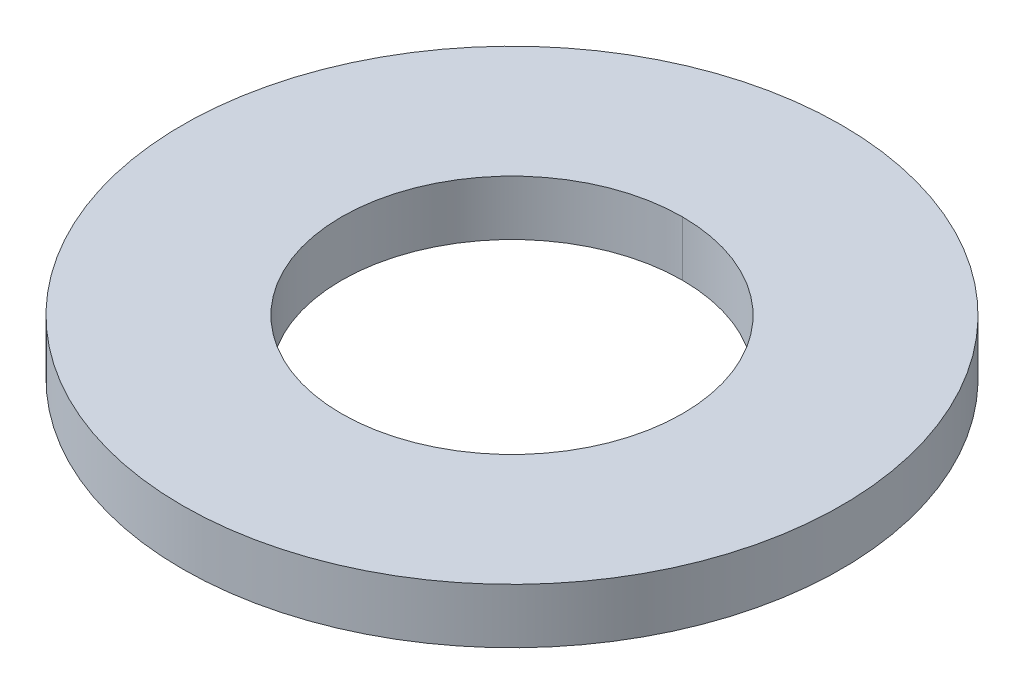
ISO-10303-21;
HEADER;
FILE_DESCRIPTION(('STEP AP214'),'2;1');
FILE_NAME('part.step','',(''),(''),'','','');
FILE_SCHEMA(('AUTOMOTIVE_DESIGN { 1 0 10303 214 1 1 1 1 }'));
ENDSEC;
DATA;
#1=APPLICATION_CONTEXT('core data for automotive mechanical design processes');
#2=APPLICATION_PROTOCOL_DEFINITION('international standard','automotive_design',2000,#1);
#3=PRODUCT_CONTEXT('',#1,'mechanical');
#4=PRODUCT('Part','Part','',(#3));
#5=PRODUCT_RELATED_PRODUCT_CATEGORY('part','',(#4));
#6=PRODUCT_DEFINITION_FORMATION('','',#4);
#7=PRODUCT_DEFINITION_CONTEXT('part definition',#1,'design');
#8=PRODUCT_DEFINITION('design','',#6,#7);
#9=PRODUCT_DEFINITION_SHAPE('','',#8);
#10=(LENGTH_UNIT() NAMED_UNIT(*) SI_UNIT(.MILLI.,.METRE.));
#11=(NAMED_UNIT(*) PLANE_ANGLE_UNIT() SI_UNIT($,.RADIAN.));
#12=(NAMED_UNIT(*) SI_UNIT($,.STERADIAN.) SOLID_ANGLE_UNIT());
#13=UNCERTAINTY_MEASURE_WITH_UNIT(LENGTH_MEASURE(1.E-05),#10,'distance_accuracy_value','');
#14=(GEOMETRIC_REPRESENTATION_CONTEXT(3) GLOBAL_UNCERTAINTY_ASSIGNED_CONTEXT((#13)) GLOBAL_UNIT_ASSIGNED_CONTEXT((#10,
#11,#12)) REPRESENTATION_CONTEXT('',''));
#15=CARTESIAN_POINT('',(0.,0.,0.));
#16=DIRECTION('',(0.,0.,1.));
#17=DIRECTION('',(1.,0.,0.));
#18=AXIS2_PLACEMENT_3D('',#15,#16,#17);
#19=CARTESIAN_POINT('',(0.,-1.5875,0.));
#20=DIRECTION('',(0.,1.,0.));
#21=DIRECTION('',(0.,0.,1.));
#22=AXIS2_PLACEMENT_3D('',#19,#20,#21);
#23=CYLINDRICAL_SURFACE('',#22,4.7625);
#24=CARTESIAN_POINT('',(0.,-0.79375,0.));
#25=DIRECTION('',(0.,-1.,0.));
#26=DIRECTION('',(0.,0.,-1.));
#27=AXIS2_PLACEMENT_3D('',#24,#25,#26);
#28=CIRCLE('',#27,4.7625);
#29=CARTESIAN_POINT('',(0.,-0.79375,-4.7625));
#30=VERTEX_POINT('',#29);
#31=EDGE_CURVE('E11',#30,#30,#28,.F.);
#32=ORIENTED_EDGE('',*,*,#31,.F.);
#33=EDGE_LOOP('',(#32));
#34=FACE_BOUND('',#33,.T.);
#35=CARTESIAN_POINT('',(0.,-1.5875,0.));
#36=DIRECTION('',(0.,1.,0.));
#37=DIRECTION('',(0.,0.,1.));
#38=AXIS2_PLACEMENT_3D('',#35,#36,#37);
#39=CIRCLE('',#38,4.7625);
#40=CARTESIAN_POINT('',(0.,-1.5875,4.7625));
#41=VERTEX_POINT('',#40);
#42=EDGE_CURVE('E93',#41,#41,#39,.T.);
#43=ORIENTED_EDGE('',*,*,#42,.T.);
#44=EDGE_LOOP('',(#43));
#45=FACE_BOUND('',#44,.T.);
#46=ADVANCED_FACE('F52',(#34,#45),#23,.T.);
#47=CARTESIAN_POINT('',(0.,-1.5875,0.));
#48=DIRECTION('',(0.,1.,0.));
#49=DIRECTION('',(1.,0.,0.));
#50=AXIS2_PLACEMENT_3D('',#47,#48,#49);
#51=PLANE('',#50);
#52=CARTESIAN_POINT('',(0.,-1.5875,0.));
#53=DIRECTION('',(0.,1.,0.));
#54=DIRECTION('',(0.,0.,1.));
#55=AXIS2_PLACEMENT_3D('',#52,#53,#54);
#56=CIRCLE('',#55,2.4638);
#57=CARTESIAN_POINT('',(0.,-1.5875,-2.4638));
#58=VERTEX_POINT('',#57);
#59=CARTESIAN_POINT('',(0.,-1.5875,2.4638));
#60=VERTEX_POINT('',#59);
#61=EDGE_CURVE('E62',#58,#60,#56,.T.);
#62=ORIENTED_EDGE('',*,*,#61,.T.);
#63=CARTESIAN_POINT('',(0.,-1.5875,0.));
#64=DIRECTION('',(0.,1.,0.));
#65=DIRECTION('',(0.,0.,1.));
#66=AXIS2_PLACEMENT_3D('',#63,#64,#65);
#67=CIRCLE('',#66,2.4638);
#68=EDGE_CURVE('E92',#60,#58,#67,.T.);
#69=ORIENTED_EDGE('',*,*,#68,.T.);
#70=EDGE_LOOP('',(#62,#69));
#71=FACE_BOUND('',#70,.T.);
#72=ORIENTED_EDGE('',*,*,#42,.F.);
#73=EDGE_LOOP('',(#72));
#74=FACE_BOUND('',#73,.T.);
#75=ADVANCED_FACE('F54',(#71,#74),#51,.F.);
#76=CARTESIAN_POINT('',(0.,1.5875,0.));
#77=DIRECTION('',(0.,-1.,0.));
#78=DIRECTION('',(0.,0.,-1.));
#79=AXIS2_PLACEMENT_3D('',#76,#77,#78);
#80=CYLINDRICAL_SURFACE('',#79,2.4638);
#81=DIRECTION('',(0.,-1.,0.));
#82=VECTOR('',#81,1.);
#83=CARTESIAN_POINT('',(0.,1.5875,2.4638));
#84=LINE('',#83,#82);
#85=CARTESIAN_POINT('',(0.,-0.79375,2.4638));
#86=VERTEX_POINT('',#85);
#87=EDGE_CURVE('E80',#86,#60,#84,.T.);
#88=ORIENTED_EDGE('',*,*,#87,.F.);
#89=CARTESIAN_POINT('',(0.,-0.79375,0.));
#90=DIRECTION('',(0.,-1.,0.));
#91=DIRECTION('',(0.,0.,-1.));
#92=AXIS2_PLACEMENT_3D('',#89,#90,#91);
#93=CIRCLE('',#92,2.4638);
#94=CARTESIAN_POINT('',(0.,-0.79375,-2.4638));
#95=VERTEX_POINT('',#94);
#96=EDGE_CURVE('E70',#86,#95,#93,.F.);
#97=ORIENTED_EDGE('',*,*,#96,.T.);
#98=DIRECTION('',(0.,-1.,0.));
#99=VECTOR('',#98,1.);
#100=CARTESIAN_POINT('',(0.,1.5875,-2.4638));
#101=LINE('',#100,#99);
#102=EDGE_CURVE('E90',#95,#58,#101,.T.);
#103=ORIENTED_EDGE('',*,*,#102,.T.);
#104=ORIENTED_EDGE('',*,*,#68,.F.);
#105=EDGE_LOOP('',(#88,#97,#103,#104));
#106=FACE_BOUND('',#105,.T.);
#107=ADVANCED_FACE('F86',(#106),#80,.F.);
#108=CARTESIAN_POINT('',(0.,1.5875,0.));
#109=DIRECTION('',(0.,-1.,0.));
#110=DIRECTION('',(0.,0.,-1.));
#111=AXIS2_PLACEMENT_3D('',#108,#109,#110);
#112=CYLINDRICAL_SURFACE('',#111,2.4638);
#113=ORIENTED_EDGE('',*,*,#102,.F.);
#114=CARTESIAN_POINT('',(0.,-0.79375,0.));
#115=DIRECTION('',(0.,-1.,0.));
#116=DIRECTION('',(0.,0.,-1.));
#117=AXIS2_PLACEMENT_3D('',#114,#115,#116);
#118=CIRCLE('',#117,2.4638);
#119=EDGE_CURVE('E81',#95,#86,#118,.F.);
#120=ORIENTED_EDGE('',*,*,#119,.T.);
#121=ORIENTED_EDGE('',*,*,#87,.T.);
#122=ORIENTED_EDGE('',*,*,#61,.F.);
#123=EDGE_LOOP('',(#113,#120,#121,#122));
#124=FACE_BOUND('',#123,.T.);
#125=ADVANCED_FACE('F91',(#124),#112,.F.);
#126=CARTESIAN_POINT('',(-4.7625,-0.79375,4.7625));
#127=DIRECTION('',(0.,-1.,0.));
#128=DIRECTION('',(0.,0.,-1.));
#129=AXIS2_PLACEMENT_3D('',#126,#127,#128);
#130=PLANE('',#129);
#131=ORIENTED_EDGE('',*,*,#31,.T.);
#132=EDGE_LOOP('',(#131));
#133=FACE_BOUND('',#132,.T.);
#134=ORIENTED_EDGE('',*,*,#119,.F.);
#135=ORIENTED_EDGE('',*,*,#96,.F.);
#136=EDGE_LOOP('',(#134,#135));
#137=FACE_BOUND('',#136,.T.);
#138=ADVANCED_FACE('F84',(#133,#137),#130,.F.);
#139=CLOSED_SHELL('',(#46,#75,#107,#125,#138));
#140=MANIFOLD_SOLID_BREP('B2',#139);
#141=ADVANCED_BREP_SHAPE_REPRESENTATION('',(#18,#140),#14);
#142=SHAPE_DEFINITION_REPRESENTATION(#9,#141);
ENDSEC;
END-ISO-10303-21;
